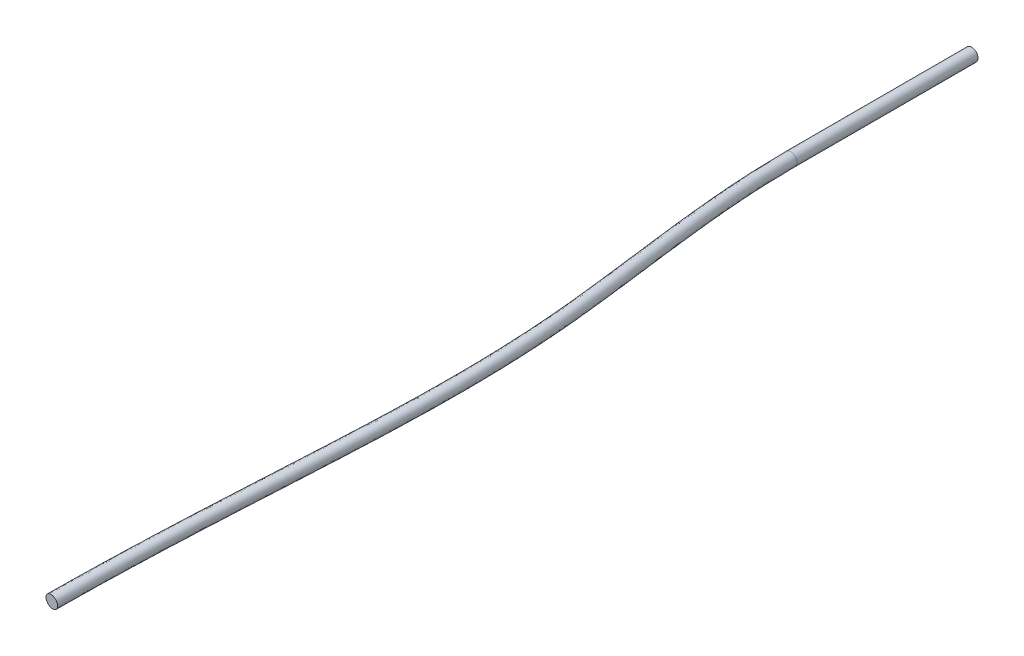
ISO-10303-21;
HEADER;
FILE_DESCRIPTION(('STEP AP214'),'2;1');
FILE_NAME('part.step','',(''),(''),'','','');
FILE_SCHEMA(('AUTOMOTIVE_DESIGN { 1 0 10303 214 1 1 1 1 }'));
ENDSEC;
DATA;
#1=APPLICATION_CONTEXT('core data for automotive mechanical design processes');
#2=APPLICATION_PROTOCOL_DEFINITION('international standard','automotive_design',2000,#1);
#3=PRODUCT_CONTEXT('',#1,'mechanical');
#4=PRODUCT('Part','Part','',(#3));
#5=PRODUCT_RELATED_PRODUCT_CATEGORY('part','',(#4));
#6=PRODUCT_DEFINITION_FORMATION('','',#4);
#7=PRODUCT_DEFINITION_CONTEXT('part definition',#1,'design');
#8=PRODUCT_DEFINITION('design','',#6,#7);
#9=PRODUCT_DEFINITION_SHAPE('','',#8);
#10=(LENGTH_UNIT() NAMED_UNIT(*) SI_UNIT(.MILLI.,.METRE.));
#11=(NAMED_UNIT(*) PLANE_ANGLE_UNIT() SI_UNIT($,.RADIAN.));
#12=(NAMED_UNIT(*) SI_UNIT($,.STERADIAN.) SOLID_ANGLE_UNIT());
#13=UNCERTAINTY_MEASURE_WITH_UNIT(LENGTH_MEASURE(1.E-05),#10,'distance_accuracy_value','');
#14=(GEOMETRIC_REPRESENTATION_CONTEXT(3) GLOBAL_UNCERTAINTY_ASSIGNED_CONTEXT((#13)) GLOBAL_UNIT_ASSIGNED_CONTEXT((#10,
#11,#12)) REPRESENTATION_CONTEXT('',''));
#15=CARTESIAN_POINT('',(0.,0.,0.));
#16=DIRECTION('',(0.,0.,1.));
#17=DIRECTION('',(1.,0.,0.));
#18=AXIS2_PLACEMENT_3D('',#15,#16,#17);
#19=CARTESIAN_POINT('',(0.,0.,33.));
#20=DIRECTION('',(0.,0.,-1.));
#21=DIRECTION('',(-1.,0.,0.));
#22=AXIS2_PLACEMENT_3D('',#19,#20,#21);
#23=CYLINDRICAL_SURFACE('',#22,1.15);
#24=CARTESIAN_POINT('',(0.,0.,33.));
#25=DIRECTION('',(0.,0.,1.));
#26=DIRECTION('',(1.,0.,0.));
#27=AXIS2_PLACEMENT_3D('',#24,#25,#26);
#28=CIRCLE('',#27,1.15);
#29=CARTESIAN_POINT('',(1.15,0.,33.));
#30=VERTEX_POINT('',#29);
#31=EDGE_CURVE('E14',#30,#30,#28,.T.);
#32=ORIENTED_EDGE('',*,*,#31,.F.);
#33=EDGE_LOOP('',(#32));
#34=FACE_BOUND('',#33,.T.);
#35=CARTESIAN_POINT('',(0.,0.,0.));
#36=DIRECTION('',(0.,0.,1.));
#37=DIRECTION('',(1.,0.,0.));
#38=AXIS2_PLACEMENT_3D('',#35,#36,#37);
#39=CIRCLE('',#38,1.15);
#40=CARTESIAN_POINT('',(1.15,0.,0.));
#41=VERTEX_POINT('',#40);
#42=EDGE_CURVE('E57',#41,#41,#39,.T.);
#43=ORIENTED_EDGE('',*,*,#42,.T.);
#44=EDGE_LOOP('',(#43));
#45=FACE_BOUND('',#44,.T.);
#46=ADVANCED_FACE('F51',(#34,#45),#23,.T.);
#47=CARTESIAN_POINT('',(0.,0.,0.));
#48=DIRECTION('',(0.,0.,1.));
#49=DIRECTION('',(1.,0.,0.));
#50=AXIS2_PLACEMENT_3D('',#47,#48,#49);
#51=PLANE('',#50);
#52=ORIENTED_EDGE('',*,*,#42,.F.);
#53=EDGE_LOOP('',(#52));
#54=FACE_BOUND('',#53,.T.);
#55=ADVANCED_FACE('F69',(#54),#51,.F.);
#56=CARTESIAN_POINT('',(-5.23983997275905,-7.77842735193139,162.567577451709));
#57=DIRECTION('',(-0.0767475009962878,-0.0694375630716014,0.994629702917373));
#58=DIRECTION('',(0.997043577287327,-0.00907860456403847,0.0762999602179469));
#59=AXIS2_PLACEMENT_3D('',#56,#57,#58);
#60=PLANE('',#59);
#61=CARTESIAN_POINT('',(-5.23983997275905,-7.77842735193139,162.567577451709));
#62=DIRECTION('',(-0.0767475009962878,-0.0694375630716014,0.994629702917373));
#63=DIRECTION('',(0.997043577287327,-0.00907860456403847,0.0762999602179469));
#64=AXIS2_PLACEMENT_3D('',#61,#62,#63);
#65=CIRCLE('',#64,1.15);
#66=CARTESIAN_POINT('',(-4.09323985887863,-7.78886774718004,162.65532240596));
#67=VERTEX_POINT('',#66);
#68=EDGE_CURVE('E61',#67,#67,#65,.T.);
#69=ORIENTED_EDGE('',*,*,#68,.T.);
#70=EDGE_LOOP('',(#69));
#71=FACE_BOUND('',#70,.T.);
#72=ADVANCED_FACE('F62',(#71),#60,.T.);
#73=CARTESIAN_POINT('',(1.15,0.,33.));
#74=CARTESIAN_POINT('',(1.15000000128631,-1.45356961818758E-10,48.6166633670489));
#75=CARTESIAN_POINT('',(3.57393749982856,-0.671801834020822,63.7265238181425));
#76=CARTESIAN_POINT('',(4.47540177854971,-2.34086467673158,91.5707550168896));
#77=CARTESIAN_POINT('',(3.09397694588622,-3.31334307802777,104.231448371406));
#78=CARTESIAN_POINT('',(-0.53180806048566,-5.44155301679544,131.240056180511));
#79=CARTESIAN_POINT('',(-2.7766743193756,-6.59770058898288,145.592940255992));
#80=CARTESIAN_POINT('',(-4.09323985887863,-7.78886774718004,162.65532240596));
#81=CARTESIAN_POINT('',(1.15,2.3,33.));
#82=CARTESIAN_POINT('',(1.15000000128973,2.29999999984782,48.6825454673187));
#83=CARTESIAN_POINT('',(3.58156028425326,1.62561906704927,63.8381622489404));
#84=CARTESIAN_POINT('',(4.48465427804476,-0.0464612218451072,91.7327321576358));
#85=CARTESIAN_POINT('',(3.10069313168009,-1.02029743614131,104.410068570646));
#86=CARTESIAN_POINT('',(-0.525870376605221,-3.14896398753026,131.424471161817));
#87=CARTESIAN_POINT('',(-2.76917482565315,-4.30432747865717,145.767819842851));
#88=CARTESIAN_POINT('',(-4.08465679601962,-5.49451427398467,162.8161591899));
#89=CARTESIAN_POINT('',(-1.15,2.3,33.));
#90=CARTESIAN_POINT('',(-1.14999999865568,2.29999999983576,48.9191417346821));
#91=CARTESIAN_POINT('',(1.28955462420995,1.61706754670736,64.1222036367305));
#92=CARTESIAN_POINT('',(2.17937608712156,-0.0304386395483671,91.6068145188142));
#93=CARTESIAN_POINT('',(0.816318587773908,-0.992730957539723,104.141493211752));
#94=CARTESIAN_POINT('',(-2.80082899858726,-3.11587125935369,131.085756192231));
#95=CARTESIAN_POINT('',(-5.0546090035143,-4.27642032807829,145.491683740359));
#96=CARTESIAN_POINT('',(-6.37785702378047,-5.47363348348738,162.640669281399));
#97=CARTESIAN_POINT('',(-1.15,0.,33.));
#98=CARTESIAN_POINT('',(-1.14999999865909,-1.57410716530813E-10,48.8532596344123));
#99=CARTESIAN_POINT('',(1.28193183978525,-0.680353354362732,64.0105652059327));
#100=CARTESIAN_POINT('',(2.17012358762651,-2.32484209443484,91.444837378068));
#101=CARTESIAN_POINT('',(0.809602401981516,-3.28577659942914,103.962873012512));
#102=CARTESIAN_POINT('',(-2.80676668246918,-5.40846028861591,130.901341210925));
#103=CARTESIAN_POINT('',(-5.06210849721436,-6.56979343837415,145.316804153023));
#104=CARTESIAN_POINT('',(-6.38644008663948,-7.76798695668275,162.479832497458));
#105=CARTESIAN_POINT('',(-1.15,-2.3,33.));
#106=CARTESIAN_POINT('',(-1.14999999866251,-2.30000000015059,48.7873775341425));
#107=CARTESIAN_POINT('',(1.27430905536055,-2.97777425543282,63.8989267751348));
#108=CARTESIAN_POINT('',(2.16087108813145,-4.61924554932131,91.2828602373218));
#109=CARTESIAN_POINT('',(0.802886216189124,-5.57882224131855,103.784252813272));
#110=CARTESIAN_POINT('',(-2.8127043663511,-7.70104931787814,130.716926229619));
#111=CARTESIAN_POINT('',(-5.06960799091442,-8.86316654867001,145.141924565687));
#112=CARTESIAN_POINT('',(-6.39502314949849,-10.0623404298781,162.318995713518));
#113=CARTESIAN_POINT('',(1.15,-2.3,33.));
#114=CARTESIAN_POINT('',(1.1500000012829,-2.30000000013853,48.5507812667791));
#115=CARTESIAN_POINT('',(3.56631471540387,-2.96922273509091,63.6148853873446));
#116=CARTESIAN_POINT('',(4.46614927905465,-4.63526813161805,91.4087778761434));
#117=CARTESIAN_POINT('',(3.08726076009234,-5.60638871991423,104.052828172166));
#118=CARTESIAN_POINT('',(-0.537745744366099,-7.73414204606063,131.055641199204));
#119=CARTESIAN_POINT('',(-2.78417381309804,-8.89107369930858,145.418060669134));
#120=CARTESIAN_POINT('',(-4.10182292173764,-10.0832212203754,162.494485622019));
#121=CARTESIAN_POINT('',(1.15,0.,33.));
#122=CARTESIAN_POINT('',(1.15000000128631,-1.45356961818758E-10,48.6166633670489));
#123=CARTESIAN_POINT('',(3.57393749982856,-0.671801834020822,63.7265238181425));
#124=CARTESIAN_POINT('',(4.47540177854971,-2.34086467673158,91.5707550168896));
#125=CARTESIAN_POINT('',(3.09397694588622,-3.31334307802777,104.231448371406));
#126=CARTESIAN_POINT('',(-0.53180806048566,-5.44155301679544,131.240056180511));
#127=CARTESIAN_POINT('',(-2.7766743193756,-6.59770058898288,145.592940255992));
#128=CARTESIAN_POINT('',(-4.09323985887863,-7.78886774718004,162.65532240596));
#129=(BOUNDED_SURFACE() B_SPLINE_SURFACE(3,3,((#73,#74,#75,#76,#77,#78,#79,#80),(#81,#82,#83,
#84,#85,#86,#87,#88),(#89,#90,#91,#92,#93,#94,#95,#96),(#97,#98,#99,#100,#101,#102,#103,#104),
(#105,#106,#107,#108,#109,#110,#111,#112),(#113,#114,#115,#116,#117,#118,#119,#120),(#121,#122,
#123,#124,#125,#126,#127,#128)),.UNSPECIFIED.,.T.,.F.,.F.) B_SPLINE_SURFACE_WITH_KNOTS((4,3,4),
(4,2,2,4),(0.,0.5,1.),(0.,0.342938832911034,0.671469416455517,1.),
.UNSPECIFIED.) GEOMETRIC_REPRESENTATION_ITEM() RATIONAL_B_SPLINE_SURFACE(((1.,1.,1.,1.,1.,1.,1.,
1.),(0.333333333333333,0.333333333333333,0.333333333333333,0.333333333333333,0.333333333333333,
0.333333333333333,0.333333333333333,0.333333333333333),(0.333333333333333,0.333333333333333,
0.333333333333333,0.333333333333333,0.333333333333333,0.333333333333333,0.333333333333333,
0.333333333333333),(1.,1.,1.,1.,1.,1.,1.,1.),(0.333333333333333,0.333333333333333,
0.333333333333333,0.333333333333333,0.333333333333333,0.333333333333333,0.333333333333333,
0.333333333333333),(0.333333333333333,0.333333333333333,0.333333333333333,0.333333333333333,
0.333333333333333,0.333333333333333,0.333333333333333,0.333333333333333),(1.,1.,1.,1.,1.,1.,1.,1.))) REPRESENTATION_ITEM('') SURFACE());
#130=ORIENTED_EDGE('',*,*,#68,.F.);
#131=EDGE_LOOP('',(#130));
#132=FACE_BOUND('',#131,.T.);
#133=ORIENTED_EDGE('',*,*,#31,.T.);
#134=EDGE_LOOP('',(#133));
#135=FACE_BOUND('',#134,.T.);
#136=ADVANCED_FACE('F71',(#132,#135),#129,.T.);
#137=CLOSED_SHELL('',(#46,#55,#72,#136));
#138=MANIFOLD_SOLID_BREP('B2',#137);
#139=ADVANCED_BREP_SHAPE_REPRESENTATION('',(#18,#138),#14);
#140=SHAPE_DEFINITION_REPRESENTATION(#9,#139);
ENDSEC;
END-ISO-10303-21;
